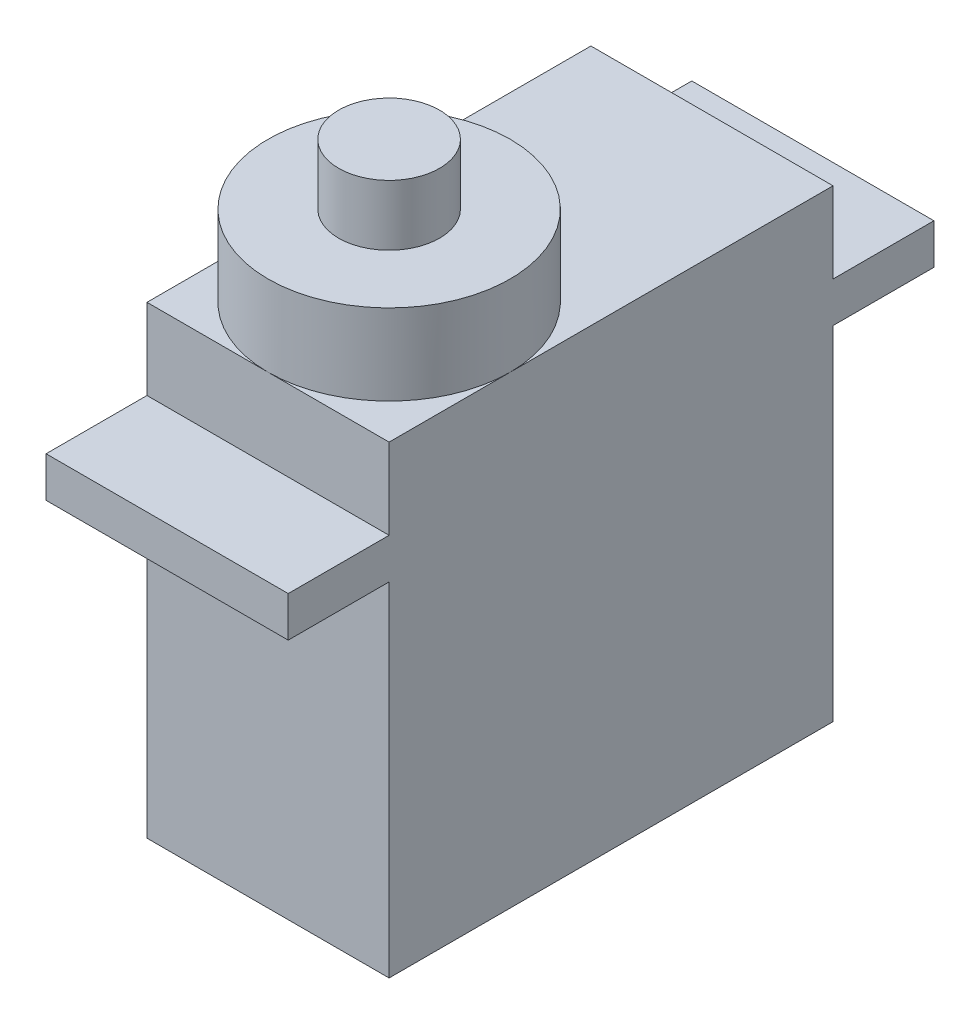
ISO-10303-21;
HEADER;
FILE_DESCRIPTION(('STEP AP214'),'2;1');
FILE_NAME('part.step','',(''),(''),'','','');
FILE_SCHEMA(('AUTOMOTIVE_DESIGN { 1 0 10303 214 1 1 1 1 }'));
ENDSEC;
DATA;
#1=APPLICATION_CONTEXT('core data for automotive mechanical design processes');
#2=APPLICATION_PROTOCOL_DEFINITION('international standard','automotive_design',2000,#1);
#3=PRODUCT_CONTEXT('',#1,'mechanical');
#4=PRODUCT('Part','Part','',(#3));
#5=PRODUCT_RELATED_PRODUCT_CATEGORY('part','',(#4));
#6=PRODUCT_DEFINITION_FORMATION('','',#4);
#7=PRODUCT_DEFINITION_CONTEXT('part definition',#1,'design');
#8=PRODUCT_DEFINITION('design','',#6,#7);
#9=PRODUCT_DEFINITION_SHAPE('','',#8);
#10=(LENGTH_UNIT() NAMED_UNIT(*) SI_UNIT(.MILLI.,.METRE.));
#11=(NAMED_UNIT(*) PLANE_ANGLE_UNIT() SI_UNIT($,.RADIAN.));
#12=(NAMED_UNIT(*) SI_UNIT($,.STERADIAN.) SOLID_ANGLE_UNIT());
#13=UNCERTAINTY_MEASURE_WITH_UNIT(LENGTH_MEASURE(1.E-05),#10,'distance_accuracy_value','');
#14=(GEOMETRIC_REPRESENTATION_CONTEXT(3) GLOBAL_UNCERTAINTY_ASSIGNED_CONTEXT((#13)) GLOBAL_UNIT_ASSIGNED_CONTEXT((#10,
#11,#12)) REPRESENTATION_CONTEXT('',''));
#15=CARTESIAN_POINT('',(0.,0.,0.));
#16=DIRECTION('',(0.,0.,1.));
#17=DIRECTION('',(1.,0.,0.));
#18=AXIS2_PLACEMENT_3D('',#15,#16,#17);
#19=CARTESIAN_POINT('',(0.,23.,0.));
#20=DIRECTION('',(0.,1.,0.));
#21=DIRECTION('',(0.,0.,1.));
#22=AXIS2_PLACEMENT_3D('',#19,#20,#21);
#23=PLANE('',#22);
#24=CARTESIAN_POINT('',(0.,23.,5.));
#25=DIRECTION('',(0.,1.,0.));
#26=DIRECTION('',(0.,0.,1.));
#27=AXIS2_PLACEMENT_3D('',#24,#25,#26);
#28=CIRCLE('',#27,6.);
#29=CARTESIAN_POINT('',(0.,23.,11.));
#30=VERTEX_POINT('',#29);
#31=CARTESIAN_POINT('',(6.,23.,5.));
#32=VERTEX_POINT('',#31);
#33=EDGE_CURVE('E159',#30,#32,#28,.T.);
#34=ORIENTED_EDGE('',*,*,#33,.F.);
#35=DIRECTION('',(1.,0.,0.));
#36=VECTOR('',#35,1.);
#37=CARTESIAN_POINT('',(6.,23.,11.));
#38=LINE('',#37,#36);
#39=CARTESIAN_POINT('',(6.,23.,11.));
#40=VERTEX_POINT('',#39);
#41=EDGE_CURVE('E146',#30,#40,#38,.T.);
#42=ORIENTED_EDGE('',*,*,#41,.T.);
#43=DIRECTION('',(0.,0.,-1.));
#44=VECTOR('',#43,1.);
#45=CARTESIAN_POINT('',(6.,23.,11.));
#46=LINE('',#45,#44);
#47=EDGE_CURVE('E160',#40,#32,#46,.T.);
#48=ORIENTED_EDGE('',*,*,#47,.T.);
#49=EDGE_LOOP('',(#34,#42,#48));
#50=FACE_BOUND('',#49,.T.);
#51=ADVANCED_FACE('F39',(#50),#23,.T.);
#52=CARTESIAN_POINT('',(-6.,23.,5.));
#53=VERTEX_POINT('',#52);
#54=EDGE_CURVE('E49',#32,#53,#28,.T.);
#55=ORIENTED_EDGE('',*,*,#54,.F.);
#56=CARTESIAN_POINT('',(6.,23.,-11.));
#57=VERTEX_POINT('',#56);
#58=EDGE_CURVE('E145',#32,#57,#46,.T.);
#59=ORIENTED_EDGE('',*,*,#58,.T.);
#60=DIRECTION('',(-1.,0.,0.));
#61=VECTOR('',#60,1.);
#62=CARTESIAN_POINT('',(6.,23.,-11.));
#63=LINE('',#62,#61);
#64=CARTESIAN_POINT('',(-6.,23.,-11.));
#65=VERTEX_POINT('',#64);
#66=EDGE_CURVE('E253',#57,#65,#63,.T.);
#67=ORIENTED_EDGE('',*,*,#66,.T.);
#68=DIRECTION('',(0.,0.,1.));
#69=VECTOR('',#68,1.);
#70=CARTESIAN_POINT('',(-6.,23.,11.));
#71=LINE('',#70,#69);
#72=EDGE_CURVE('E157',#65,#53,#71,.T.);
#73=ORIENTED_EDGE('',*,*,#72,.T.);
#74=EDGE_LOOP('',(#55,#59,#67,#73));
#75=FACE_BOUND('',#74,.T.);
#76=ADVANCED_FACE('F334',(#75),#23,.T.);
#77=CARTESIAN_POINT('',(6.,23.,11.));
#78=DIRECTION('',(0.,0.,-1.));
#79=DIRECTION('',(-1.,0.,0.));
#80=AXIS2_PLACEMENT_3D('',#77,#78,#79);
#81=PLANE('',#80);
#82=DIRECTION('',(-1.,0.,0.));
#83=VECTOR('',#82,1.);
#84=CARTESIAN_POINT('',(6.,19.,11.));
#85=LINE('',#84,#83);
#86=CARTESIAN_POINT('',(6.,19.,11.));
#87=VERTEX_POINT('',#86);
#88=CARTESIAN_POINT('',(-6.,19.,11.));
#89=VERTEX_POINT('',#88);
#90=EDGE_CURVE('E189',#87,#89,#85,.T.);
#91=ORIENTED_EDGE('',*,*,#90,.F.);
#92=DIRECTION('',(0.,-1.,0.));
#93=VECTOR('',#92,1.);
#94=CARTESIAN_POINT('',(6.,23.,11.));
#95=LINE('',#94,#93);
#96=EDGE_CURVE('E152',#40,#87,#95,.T.);
#97=ORIENTED_EDGE('',*,*,#96,.F.);
#98=ORIENTED_EDGE('',*,*,#41,.F.);
#99=CARTESIAN_POINT('',(-6.,23.,11.));
#100=VERTEX_POINT('',#99);
#101=EDGE_CURVE('E138',#100,#30,#38,.T.);
#102=ORIENTED_EDGE('',*,*,#101,.F.);
#103=DIRECTION('',(0.,-1.,0.));
#104=VECTOR('',#103,1.);
#105=CARTESIAN_POINT('',(-6.,23.,11.));
#106=LINE('',#105,#104);
#107=EDGE_CURVE('E43',#100,#89,#106,.T.);
#108=ORIENTED_EDGE('',*,*,#107,.T.);
#109=EDGE_LOOP('',(#91,#97,#98,#102,#108));
#110=FACE_BOUND('',#109,.T.);
#111=ADVANCED_FACE('F150',(#110),#81,.F.);
#112=CARTESIAN_POINT('',(6.,23.,-11.));
#113=DIRECTION('',(0.,0.,1.));
#114=DIRECTION('',(1.,0.,0.));
#115=AXIS2_PLACEMENT_3D('',#112,#113,#114);
#116=PLANE('',#115);
#117=DIRECTION('',(-1.,0.,0.));
#118=VECTOR('',#117,1.);
#119=CARTESIAN_POINT('',(6.,17.,-11.));
#120=LINE('',#119,#118);
#121=CARTESIAN_POINT('',(6.,17.,-11.));
#122=VERTEX_POINT('',#121);
#123=CARTESIAN_POINT('',(-6.,17.,-11.));
#124=VERTEX_POINT('',#123);
#125=EDGE_CURVE('E210',#122,#124,#120,.T.);
#126=ORIENTED_EDGE('',*,*,#125,.F.);
#127=DIRECTION('',(0.,-1.,0.));
#128=VECTOR('',#127,1.);
#129=CARTESIAN_POINT('',(6.,23.,-11.));
#130=LINE('',#129,#128);
#131=CARTESIAN_POINT('',(6.,0.,-11.));
#132=VERTEX_POINT('',#131);
#133=EDGE_CURVE('E276',#122,#132,#130,.T.);
#134=ORIENTED_EDGE('',*,*,#133,.T.);
#135=DIRECTION('',(-1.,0.,0.));
#136=VECTOR('',#135,1.);
#137=CARTESIAN_POINT('',(6.,0.,-11.));
#138=LINE('',#137,#136);
#139=CARTESIAN_POINT('',(-6.,0.,-11.));
#140=VERTEX_POINT('',#139);
#141=EDGE_CURVE('E268',#132,#140,#138,.T.);
#142=ORIENTED_EDGE('',*,*,#141,.T.);
#143=DIRECTION('',(0.,-1.,0.));
#144=VECTOR('',#143,1.);
#145=CARTESIAN_POINT('',(-6.,23.,-11.));
#146=LINE('',#145,#144);
#147=EDGE_CURVE('E256',#124,#140,#146,.T.);
#148=ORIENTED_EDGE('',*,*,#147,.F.);
#149=EDGE_LOOP('',(#126,#134,#142,#148));
#150=FACE_BOUND('',#149,.T.);
#151=ADVANCED_FACE('F297',(#150),#116,.F.);
#152=CARTESIAN_POINT('',(-6.,23.,11.));
#153=DIRECTION('',(1.,0.,0.));
#154=DIRECTION('',(0.,0.,-1.));
#155=AXIS2_PLACEMENT_3D('',#152,#153,#154);
#156=PLANE('',#155);
#157=DIRECTION('',(0.,0.,1.));
#158=VECTOR('',#157,1.);
#159=CARTESIAN_POINT('',(-6.,0.,11.));
#160=LINE('',#159,#158);
#161=CARTESIAN_POINT('',(-6.,0.,11.));
#162=VERTEX_POINT('',#161);
#163=EDGE_CURVE('E248',#140,#162,#160,.T.);
#164=ORIENTED_EDGE('',*,*,#163,.T.);
#165=CARTESIAN_POINT('',(-6.,17.,11.));
#166=VERTEX_POINT('',#165);
#167=EDGE_CURVE('E170',#166,#162,#106,.T.);
#168=ORIENTED_EDGE('',*,*,#167,.F.);
#169=DIRECTION('',(0.,0.,-1.));
#170=VECTOR('',#169,1.);
#171=CARTESIAN_POINT('',(-6.,17.,16.));
#172=LINE('',#171,#170);
#173=CARTESIAN_POINT('',(-6.,17.,16.));
#174=VERTEX_POINT('',#173);
#175=EDGE_CURVE('E198',#174,#166,#172,.T.);
#176=ORIENTED_EDGE('',*,*,#175,.F.);
#177=DIRECTION('',(0.,-1.,0.));
#178=VECTOR('',#177,1.);
#179=CARTESIAN_POINT('',(-6.,19.,16.));
#180=LINE('',#179,#178);
#181=CARTESIAN_POINT('',(-6.,19.,16.));
#182=VERTEX_POINT('',#181);
#183=EDGE_CURVE('E181',#182,#174,#180,.T.);
#184=ORIENTED_EDGE('',*,*,#183,.F.);
#185=DIRECTION('',(0.,0.,-1.));
#186=VECTOR('',#185,1.);
#187=CARTESIAN_POINT('',(-6.,19.,16.));
#188=LINE('',#187,#186);
#189=EDGE_CURVE('E202',#182,#89,#188,.T.);
#190=ORIENTED_EDGE('',*,*,#189,.T.);
#191=ORIENTED_EDGE('',*,*,#107,.F.);
#192=EDGE_CURVE('E141',#53,#100,#71,.T.);
#193=ORIENTED_EDGE('',*,*,#192,.F.);
#194=ORIENTED_EDGE('',*,*,#72,.F.);
#195=CARTESIAN_POINT('',(-6.,19.,-11.));
#196=VERTEX_POINT('',#195);
#197=EDGE_CURVE('E272',#65,#196,#146,.T.);
#198=ORIENTED_EDGE('',*,*,#197,.T.);
#199=DIRECTION('',(0.,0.,1.));
#200=VECTOR('',#199,1.);
#201=CARTESIAN_POINT('',(-6.,19.,-16.));
#202=LINE('',#201,#200);
#203=CARTESIAN_POINT('',(-6.,19.,-16.));
#204=VERTEX_POINT('',#203);
#205=EDGE_CURVE('E236',#204,#196,#202,.T.);
#206=ORIENTED_EDGE('',*,*,#205,.F.);
#207=DIRECTION('',(0.,-1.,0.));
#208=VECTOR('',#207,1.);
#209=CARTESIAN_POINT('',(-6.,19.,-16.));
#210=LINE('',#209,#208);
#211=CARTESIAN_POINT('',(-6.,17.,-16.));
#212=VERTEX_POINT('',#211);
#213=EDGE_CURVE('E219',#204,#212,#210,.T.);
#214=ORIENTED_EDGE('',*,*,#213,.T.);
#215=DIRECTION('',(0.,0.,1.));
#216=VECTOR('',#215,1.);
#217=CARTESIAN_POINT('',(-6.,17.,-16.));
#218=LINE('',#217,#216);
#219=EDGE_CURVE('E240',#212,#124,#218,.T.);
#220=ORIENTED_EDGE('',*,*,#219,.T.);
#221=ORIENTED_EDGE('',*,*,#147,.T.);
#222=EDGE_LOOP('',(#164,#168,#176,#184,#190,#191,#193,#194,#198,#206,#214,#220,#221));
#223=FACE_BOUND('',#222,.T.);
#224=ADVANCED_FACE('F41',(#223),#156,.F.);
#225=CARTESIAN_POINT('',(6.,17.,11.));
#226=VERTEX_POINT('',#225);
#227=CARTESIAN_POINT('',(6.,0.,11.));
#228=VERTEX_POINT('',#227);
#229=EDGE_CURVE('E279',#226,#228,#95,.T.);
#230=ORIENTED_EDGE('',*,*,#229,.F.);
#231=DIRECTION('',(-1.,0.,0.));
#232=VECTOR('',#231,1.);
#233=CARTESIAN_POINT('',(6.,17.,11.));
#234=LINE('',#233,#232);
#235=EDGE_CURVE('E178',#226,#166,#234,.T.);
#236=ORIENTED_EDGE('',*,*,#235,.T.);
#237=ORIENTED_EDGE('',*,*,#167,.T.);
#238=DIRECTION('',(1.,0.,0.));
#239=VECTOR('',#238,1.);
#240=CARTESIAN_POINT('',(6.,0.,11.));
#241=LINE('',#240,#239);
#242=EDGE_CURVE('E260',#162,#228,#241,.T.);
#243=ORIENTED_EDGE('',*,*,#242,.T.);
#244=EDGE_LOOP('',(#230,#236,#237,#243));
#245=FACE_BOUND('',#244,.T.);
#246=ADVANCED_FACE('F291',(#245),#81,.F.);
#247=CARTESIAN_POINT('',(6.,23.,11.));
#248=DIRECTION('',(-1.,0.,0.));
#249=DIRECTION('',(0.,0.,1.));
#250=AXIS2_PLACEMENT_3D('',#247,#248,#249);
#251=PLANE('',#250);
#252=DIRECTION('',(0.,0.,-1.));
#253=VECTOR('',#252,1.);
#254=CARTESIAN_POINT('',(6.,0.,11.));
#255=LINE('',#254,#253);
#256=EDGE_CURVE('E264',#228,#132,#255,.T.);
#257=ORIENTED_EDGE('',*,*,#256,.T.);
#258=ORIENTED_EDGE('',*,*,#133,.F.);
#259=DIRECTION('',(0.,0.,1.));
#260=VECTOR('',#259,1.);
#261=CARTESIAN_POINT('',(6.,17.,-16.));
#262=LINE('',#261,#260);
#263=CARTESIAN_POINT('',(6.,17.,-16.));
#264=VERTEX_POINT('',#263);
#265=EDGE_CURVE('E244',#264,#122,#262,.T.);
#266=ORIENTED_EDGE('',*,*,#265,.F.);
#267=DIRECTION('',(0.,-1.,0.));
#268=VECTOR('',#267,1.);
#269=CARTESIAN_POINT('',(6.,19.,-16.));
#270=LINE('',#269,#268);
#271=CARTESIAN_POINT('',(6.,19.,-16.));
#272=VERTEX_POINT('',#271);
#273=EDGE_CURVE('E211',#272,#264,#270,.T.);
#274=ORIENTED_EDGE('',*,*,#273,.F.);
#275=DIRECTION('',(0.,0.,1.));
#276=VECTOR('',#275,1.);
#277=CARTESIAN_POINT('',(6.,19.,-16.));
#278=LINE('',#277,#276);
#279=CARTESIAN_POINT('',(6.,19.,-11.));
#280=VERTEX_POINT('',#279);
#281=EDGE_CURVE('E227',#272,#280,#278,.T.);
#282=ORIENTED_EDGE('',*,*,#281,.T.);
#283=EDGE_CURVE('E277',#57,#280,#130,.T.);
#284=ORIENTED_EDGE('',*,*,#283,.F.);
#285=ORIENTED_EDGE('',*,*,#58,.F.);
#286=ORIENTED_EDGE('',*,*,#47,.F.);
#287=ORIENTED_EDGE('',*,*,#96,.T.);
#288=DIRECTION('',(0.,0.,-1.));
#289=VECTOR('',#288,1.);
#290=CARTESIAN_POINT('',(6.,19.,16.));
#291=LINE('',#290,#289);
#292=CARTESIAN_POINT('',(6.,19.,16.));
#293=VERTEX_POINT('',#292);
#294=EDGE_CURVE('E206',#293,#87,#291,.T.);
#295=ORIENTED_EDGE('',*,*,#294,.F.);
#296=DIRECTION('',(0.,-1.,0.));
#297=VECTOR('',#296,1.);
#298=CARTESIAN_POINT('',(6.,19.,16.));
#299=LINE('',#298,#297);
#300=CARTESIAN_POINT('',(6.,17.,16.));
#301=VERTEX_POINT('',#300);
#302=EDGE_CURVE('E173',#293,#301,#299,.T.);
#303=ORIENTED_EDGE('',*,*,#302,.T.);
#304=DIRECTION('',(0.,0.,-1.));
#305=VECTOR('',#304,1.);
#306=CARTESIAN_POINT('',(6.,17.,16.));
#307=LINE('',#306,#305);
#308=EDGE_CURVE('E188',#301,#226,#307,.T.);
#309=ORIENTED_EDGE('',*,*,#308,.T.);
#310=ORIENTED_EDGE('',*,*,#229,.T.);
#311=EDGE_LOOP('',(#257,#258,#266,#274,#282,#284,#285,#286,#287,#295,#303,#309,#310));
#312=FACE_BOUND('',#311,.T.);
#313=ADVANCED_FACE('F284',(#312),#251,.F.);
#314=ORIENTED_EDGE('',*,*,#283,.T.);
#315=DIRECTION('',(-1.,0.,0.));
#316=VECTOR('',#315,1.);
#317=CARTESIAN_POINT('',(6.,19.,-11.));
#318=LINE('',#317,#316);
#319=EDGE_CURVE('E216',#280,#196,#318,.T.);
#320=ORIENTED_EDGE('',*,*,#319,.T.);
#321=ORIENTED_EDGE('',*,*,#197,.F.);
#322=ORIENTED_EDGE('',*,*,#66,.F.);
#323=EDGE_LOOP('',(#314,#320,#321,#322));
#324=FACE_BOUND('',#323,.T.);
#325=ADVANCED_FACE('F342',(#324),#116,.F.);
#326=EDGE_CURVE('E64',#53,#30,#28,.T.);
#327=ORIENTED_EDGE('',*,*,#326,.F.);
#328=ORIENTED_EDGE('',*,*,#192,.T.);
#329=ORIENTED_EDGE('',*,*,#101,.T.);
#330=EDGE_LOOP('',(#327,#328,#329));
#331=FACE_BOUND('',#330,.T.);
#332=ADVANCED_FACE('F140',(#331),#23,.T.);
#333=CARTESIAN_POINT('',(0.,0.,0.));
#334=DIRECTION('',(0.,1.,0.));
#335=DIRECTION('',(0.,0.,1.));
#336=AXIS2_PLACEMENT_3D('',#333,#334,#335);
#337=PLANE('',#336);
#338=ORIENTED_EDGE('',*,*,#163,.F.);
#339=ORIENTED_EDGE('',*,*,#141,.F.);
#340=ORIENTED_EDGE('',*,*,#256,.F.);
#341=ORIENTED_EDGE('',*,*,#242,.F.);
#342=EDGE_LOOP('',(#338,#339,#340,#341));
#343=FACE_BOUND('',#342,.T.);
#344=ADVANCED_FACE('F295',(#343),#337,.F.);
#345=CARTESIAN_POINT('',(6.,17.,-16.));
#346=DIRECTION('',(0.,1.,0.));
#347=DIRECTION('',(0.,0.,1.));
#348=AXIS2_PLACEMENT_3D('',#345,#346,#347);
#349=PLANE('',#348);
#350=ORIENTED_EDGE('',*,*,#125,.T.);
#351=ORIENTED_EDGE('',*,*,#219,.F.);
#352=DIRECTION('',(-1.,0.,0.));
#353=VECTOR('',#352,1.);
#354=CARTESIAN_POINT('',(6.,17.,-16.));
#355=LINE('',#354,#353);
#356=EDGE_CURVE('E215',#264,#212,#355,.T.);
#357=ORIENTED_EDGE('',*,*,#356,.F.);
#358=ORIENTED_EDGE('',*,*,#265,.T.);
#359=EDGE_LOOP('',(#350,#351,#357,#358));
#360=FACE_BOUND('',#359,.T.);
#361=ADVANCED_FACE('F347',(#360),#349,.F.);
#362=CARTESIAN_POINT('',(6.,19.,-16.));
#363=DIRECTION('',(0.,1.,0.));
#364=DIRECTION('',(0.,0.,1.));
#365=AXIS2_PLACEMENT_3D('',#362,#363,#364);
#366=PLANE('',#365);
#367=ORIENTED_EDGE('',*,*,#319,.F.);
#368=ORIENTED_EDGE('',*,*,#281,.F.);
#369=DIRECTION('',(-1.,0.,0.));
#370=VECTOR('',#369,1.);
#371=CARTESIAN_POINT('',(6.,19.,-16.));
#372=LINE('',#371,#370);
#373=EDGE_CURVE('E223',#272,#204,#372,.T.);
#374=ORIENTED_EDGE('',*,*,#373,.T.);
#375=ORIENTED_EDGE('',*,*,#205,.T.);
#376=EDGE_LOOP('',(#367,#368,#374,#375));
#377=FACE_BOUND('',#376,.T.);
#378=ADVANCED_FACE('F447',(#377),#366,.T.);
#379=CARTESIAN_POINT('',(0.,0.,-16.));
#380=DIRECTION('',(0.,0.,-1.));
#381=DIRECTION('',(-1.,0.,0.));
#382=AXIS2_PLACEMENT_3D('',#379,#380,#381);
#383=PLANE('',#382);
#384=ORIENTED_EDGE('',*,*,#273,.T.);
#385=ORIENTED_EDGE('',*,*,#356,.T.);
#386=ORIENTED_EDGE('',*,*,#213,.F.);
#387=ORIENTED_EDGE('',*,*,#373,.F.);
#388=EDGE_LOOP('',(#384,#385,#386,#387));
#389=FACE_BOUND('',#388,.T.);
#390=ADVANCED_FACE('F437',(#389),#383,.T.);
#391=CARTESIAN_POINT('',(6.,19.,16.));
#392=DIRECTION('',(0.,-1.,0.));
#393=DIRECTION('',(0.,0.,-1.));
#394=AXIS2_PLACEMENT_3D('',#391,#392,#393);
#395=PLANE('',#394);
#396=ORIENTED_EDGE('',*,*,#90,.T.);
#397=ORIENTED_EDGE('',*,*,#189,.F.);
#398=DIRECTION('',(-1.,0.,0.));
#399=VECTOR('',#398,1.);
#400=CARTESIAN_POINT('',(6.,19.,16.));
#401=LINE('',#400,#399);
#402=EDGE_CURVE('E177',#293,#182,#401,.T.);
#403=ORIENTED_EDGE('',*,*,#402,.F.);
#404=ORIENTED_EDGE('',*,*,#294,.T.);
#405=EDGE_LOOP('',(#396,#397,#403,#404));
#406=FACE_BOUND('',#405,.T.);
#407=ADVANCED_FACE('F430',(#406),#395,.F.);
#408=CARTESIAN_POINT('',(6.,17.,16.));
#409=DIRECTION('',(0.,-1.,0.));
#410=DIRECTION('',(0.,0.,-1.));
#411=AXIS2_PLACEMENT_3D('',#408,#409,#410);
#412=PLANE('',#411);
#413=ORIENTED_EDGE('',*,*,#235,.F.);
#414=ORIENTED_EDGE('',*,*,#308,.F.);
#415=DIRECTION('',(-1.,0.,0.));
#416=VECTOR('',#415,1.);
#417=CARTESIAN_POINT('',(6.,17.,16.));
#418=LINE('',#417,#416);
#419=EDGE_CURVE('E184',#301,#174,#418,.T.);
#420=ORIENTED_EDGE('',*,*,#419,.T.);
#421=ORIENTED_EDGE('',*,*,#175,.T.);
#422=EDGE_LOOP('',(#413,#414,#420,#421));
#423=FACE_BOUND('',#422,.T.);
#424=ADVANCED_FACE('F330',(#423),#412,.T.);
#425=CARTESIAN_POINT('',(0.,0.,16.));
#426=DIRECTION('',(0.,0.,1.));
#427=DIRECTION('',(-1.,0.,0.));
#428=AXIS2_PLACEMENT_3D('',#425,#426,#427);
#429=PLANE('',#428);
#430=ORIENTED_EDGE('',*,*,#302,.F.);
#431=ORIENTED_EDGE('',*,*,#402,.T.);
#432=ORIENTED_EDGE('',*,*,#183,.T.);
#433=ORIENTED_EDGE('',*,*,#419,.F.);
#434=EDGE_LOOP('',(#430,#431,#432,#433));
#435=FACE_BOUND('',#434,.T.);
#436=ADVANCED_FACE('F325',(#435),#429,.T.);
#437=CARTESIAN_POINT('',(0.,27.,5.));
#438=DIRECTION('',(0.,-1.,0.));
#439=DIRECTION('',(0.,0.,-1.));
#440=AXIS2_PLACEMENT_3D('',#437,#438,#439);
#441=CYLINDRICAL_SURFACE('',#440,6.);
#442=CARTESIAN_POINT('',(0.,27.,5.));
#443=DIRECTION('',(0.,1.,0.));
#444=DIRECTION('',(0.,0.,1.));
#445=AXIS2_PLACEMENT_3D('',#442,#443,#444);
#446=CIRCLE('',#445,6.);
#447=CARTESIAN_POINT('',(0.,27.,11.));
#448=VERTEX_POINT('',#447);
#449=EDGE_CURVE('E163',#448,#448,#446,.T.);
#450=ORIENTED_EDGE('',*,*,#449,.F.);
#451=EDGE_LOOP('',(#450));
#452=FACE_BOUND('',#451,.T.);
#453=ORIENTED_EDGE('',*,*,#33,.T.);
#454=ORIENTED_EDGE('',*,*,#54,.T.);
#455=ORIENTED_EDGE('',*,*,#326,.T.);
#456=EDGE_LOOP('',(#453,#454,#455));
#457=FACE_BOUND('',#456,.T.);
#458=ADVANCED_FACE('F166',(#452,#457),#441,.T.);
#459=CARTESIAN_POINT('',(0.,27.,5.));
#460=DIRECTION('',(0.,1.,0.));
#461=DIRECTION('',(0.,0.,1.));
#462=AXIS2_PLACEMENT_3D('',#459,#460,#461);
#463=PLANE('',#462);
#464=CARTESIAN_POINT('',(0.,27.,5.));
#465=DIRECTION('',(0.,1.,0.));
#466=DIRECTION('',(0.,0.,1.));
#467=AXIS2_PLACEMENT_3D('',#464,#465,#466);
#468=CIRCLE('',#467,2.5);
#469=CARTESIAN_POINT('',(0.,27.,7.5));
#470=VERTEX_POINT('',#469);
#471=EDGE_CURVE('E11',#470,#470,#468,.T.);
#472=ORIENTED_EDGE('',*,*,#471,.F.);
#473=EDGE_LOOP('',(#472));
#474=FACE_BOUND('',#473,.T.);
#475=ORIENTED_EDGE('',*,*,#449,.T.);
#476=EDGE_LOOP('',(#475));
#477=FACE_BOUND('',#476,.T.);
#478=ADVANCED_FACE('F315',(#474,#477),#463,.T.);
#479=CARTESIAN_POINT('',(0.,30.,5.));
#480=DIRECTION('',(0.,-1.,0.));
#481=DIRECTION('',(0.,0.,-1.));
#482=AXIS2_PLACEMENT_3D('',#479,#480,#481);
#483=CYLINDRICAL_SURFACE('',#482,2.5);
#484=CARTESIAN_POINT('',(0.,30.,5.));
#485=DIRECTION('',(0.,1.,0.));
#486=DIRECTION('',(0.,0.,1.));
#487=AXIS2_PLACEMENT_3D('',#484,#485,#486);
#488=CIRCLE('',#487,2.5);
#489=CARTESIAN_POINT('',(0.,30.,7.5));
#490=VERTEX_POINT('',#489);
#491=EDGE_CURVE('E164',#490,#490,#488,.T.);
#492=ORIENTED_EDGE('',*,*,#491,.F.);
#493=EDGE_LOOP('',(#492));
#494=FACE_BOUND('',#493,.T.);
#495=ORIENTED_EDGE('',*,*,#471,.T.);
#496=EDGE_LOOP('',(#495));
#497=FACE_BOUND('',#496,.T.);
#498=ADVANCED_FACE('F312',(#494,#497),#483,.T.);
#499=CARTESIAN_POINT('',(0.,30.,5.));
#500=DIRECTION('',(0.,1.,0.));
#501=DIRECTION('',(0.,0.,1.));
#502=AXIS2_PLACEMENT_3D('',#499,#500,#501);
#503=PLANE('',#502);
#504=ORIENTED_EDGE('',*,*,#491,.T.);
#505=EDGE_LOOP('',(#504));
#506=FACE_BOUND('',#505,.T.);
#507=ADVANCED_FACE('F310',(#506),#503,.T.);
#508=CLOSED_SHELL('',(#51,#76,#111,#151,#224,#246,#313,#325,#332,#344,#361,#378,#390,#407,#424,
#436,#458,#478,#498,#507));
#509=MANIFOLD_SOLID_BREP('B2',#508);
#510=ADVANCED_BREP_SHAPE_REPRESENTATION('',(#18,#509),#14);
#511=SHAPE_DEFINITION_REPRESENTATION(#9,#510);
ENDSEC;
END-ISO-10303-21;
